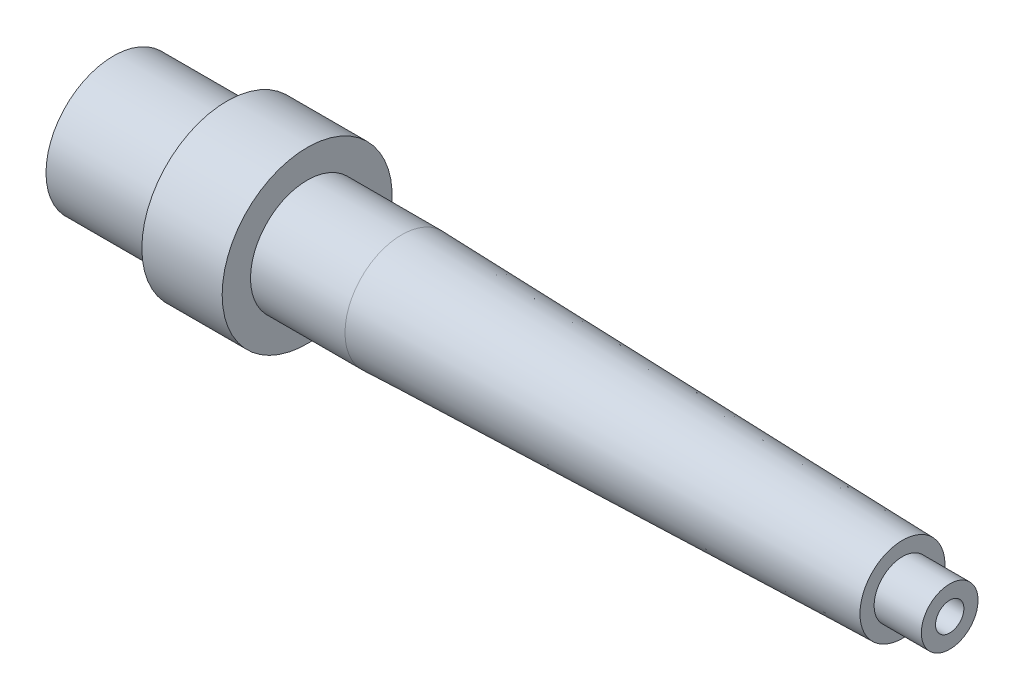
ISO-10303-21;
HEADER;
FILE_DESCRIPTION(('STEP AP214'),'2;1');
FILE_NAME('part.step','',(''),(''),'','','');
FILE_SCHEMA(('AUTOMOTIVE_DESIGN { 1 0 10303 214 1 1 1 1 }'));
ENDSEC;
DATA;
#1=APPLICATION_CONTEXT('core data for automotive mechanical design processes');
#2=APPLICATION_PROTOCOL_DEFINITION('international standard','automotive_design',2000,#1);
#3=PRODUCT_CONTEXT('',#1,'mechanical');
#4=PRODUCT('Part','Part','',(#3));
#5=PRODUCT_RELATED_PRODUCT_CATEGORY('part','',(#4));
#6=PRODUCT_DEFINITION_FORMATION('','',#4);
#7=PRODUCT_DEFINITION_CONTEXT('part definition',#1,'design');
#8=PRODUCT_DEFINITION('design','',#6,#7);
#9=PRODUCT_DEFINITION_SHAPE('','',#8);
#10=(LENGTH_UNIT() NAMED_UNIT(*) SI_UNIT(.MILLI.,.METRE.));
#11=(NAMED_UNIT(*) PLANE_ANGLE_UNIT() SI_UNIT($,.RADIAN.));
#12=(NAMED_UNIT(*) SI_UNIT($,.STERADIAN.) SOLID_ANGLE_UNIT());
#13=UNCERTAINTY_MEASURE_WITH_UNIT(LENGTH_MEASURE(1.E-05),#10,'distance_accuracy_value','');
#14=(GEOMETRIC_REPRESENTATION_CONTEXT(3) GLOBAL_UNCERTAINTY_ASSIGNED_CONTEXT((#13)) GLOBAL_UNIT_ASSIGNED_CONTEXT((#10,
#11,#12)) REPRESENTATION_CONTEXT('',''));
#15=CARTESIAN_POINT('',(0.,0.,0.));
#16=DIRECTION('',(0.,0.,1.));
#17=DIRECTION('',(1.,0.,0.));
#18=AXIS2_PLACEMENT_3D('',#15,#16,#17);
#19=CARTESIAN_POINT('',(-3.60822483003176E-13,7.14375000000422,-1.55431223447522E-12));
#20=DIRECTION('',(1.,0.,0.));
#21=DIRECTION('',(0.,0.,-1.));
#22=AXIS2_PLACEMENT_3D('',#19,#20,#21);
#23=PLANE('',#22);
#24=CARTESIAN_POINT('',(-3.60822483003176E-13,2.77555756156289E-13,-7.7715611723761E-12));
#25=DIRECTION('',(-1.,0.,0.));
#26=DIRECTION('',(0.,0.,1.));
#27=AXIS2_PLACEMENT_3D('',#24,#25,#26);
#28=CIRCLE('',#27,7.14375000000028);
#29=CARTESIAN_POINT('',(-3.63697526956086E-13,2.77555756156289E-13,7.1437499999925));
#30=VERTEX_POINT('',#29);
#31=EDGE_CURVE('E17',#30,#30,#28,.F.);
#32=ORIENTED_EDGE('',*,*,#31,.F.);
#33=EDGE_LOOP('',(#32));
#34=FACE_BOUND('',#33,.T.);
#35=CARTESIAN_POINT('',(0.,2.77555756156289E-13,-7.77156117237619E-12));
#36=DIRECTION('',(-1.,0.,0.));
#37=DIRECTION('',(0.,0.,1.));
#38=AXIS2_PLACEMENT_3D('',#35,#36,#37);
#39=CIRCLE('',#38,3.00000000000108);
#40=CARTESIAN_POINT('',(0.,2.77555756156289E-13,2.99999999999331));
#41=VERTEX_POINT('',#40);
#42=EDGE_CURVE('E48',#41,#41,#39,.F.);
#43=ORIENTED_EDGE('',*,*,#42,.T.);
#44=EDGE_LOOP('',(#43));
#45=FACE_BOUND('',#44,.T.);
#46=ADVANCED_FACE('F14',(#34,#45),#23,.F.);
#47=CARTESIAN_POINT('',(-3.60822483003176E-13,2.77555756156289E-13,-7.7715611723761E-12));
#48=DIRECTION('',(-1.,0.,0.));
#49=DIRECTION('',(0.,0.,1.));
#50=AXIS2_PLACEMENT_3D('',#47,#48,#49);
#51=CYLINDRICAL_SURFACE('',#50,7.14375000000028);
#52=ORIENTED_EDGE('',*,*,#31,.T.);
#53=EDGE_LOOP('',(#52));
#54=FACE_BOUND('',#53,.T.);
#55=CARTESIAN_POINT('',(12.,2.79554157600615E-13,-7.76673170221898E-12));
#56=DIRECTION('',(-1.,0.,0.));
#57=DIRECTION('',(0.,0.,1.));
#58=AXIS2_PLACEMENT_3D('',#55,#56,#57);
#59=CIRCLE('',#58,7.14375000000028);
#60=CARTESIAN_POINT('',(12.,2.79554157600615E-13,7.14374999999251));
#61=VERTEX_POINT('',#60);
#62=EDGE_CURVE('E46',#61,#61,#59,.T.);
#63=ORIENTED_EDGE('',*,*,#62,.T.);
#64=EDGE_LOOP('',(#63));
#65=FACE_BOUND('',#64,.T.);
#66=ADVANCED_FACE('F55',(#54,#65),#51,.T.);
#67=CARTESIAN_POINT('',(2.27374882810771E-10,2.77555756156327E-13,-7.7715611723761E-12));
#68=DIRECTION('',(-1.,0.,0.));
#69=DIRECTION('',(0.,0.,1.));
#70=AXIS2_PLACEMENT_3D('',#67,#68,#69);
#71=CONICAL_SURFACE('',#70,2.99999999999723,0.016947529806404);
#72=CARTESIAN_POINT('',(88.5000000000105,2.922939668086E-13,-7.73594382996721E-12));
#73=DIRECTION('',(-1.,0.,0.));
#74=DIRECTION('',(0.,0.,1.));
#75=AXIS2_PLACEMENT_3D('',#72,#73,#74);
#76=CIRCLE('',#75,1.50000000000099);
#77=CARTESIAN_POINT('',(88.5000000000105,2.922939668086E-13,1.49999999999325));
#78=VERTEX_POINT('',#77);
#79=EDGE_CURVE('E43',#78,#78,#76,.F.);
#80=ORIENTED_EDGE('',*,*,#79,.T.);
#81=EDGE_LOOP('',(#80));
#82=FACE_BOUND('',#81,.T.);
#83=ORIENTED_EDGE('',*,*,#42,.F.);
#84=EDGE_LOOP('',(#83));
#85=FACE_BOUND('',#84,.T.);
#86=ADVANCED_FACE('F63',(#82,#85),#71,.F.);
#87=CARTESIAN_POINT('',(11.9999999999998,8.9999999999989,-7.99360577730113E-12));
#88=DIRECTION('',(1.,0.,0.));
#89=DIRECTION('',(0.,0.,-1.));
#90=AXIS2_PLACEMENT_3D('',#87,#88,#89);
#91=PLANE('',#90);
#92=CARTESIAN_POINT('',(12.,2.79554157600615E-13,-7.76673170221898E-12));
#93=DIRECTION('',(-1.,0.,0.));
#94=DIRECTION('',(0.,0.,1.));
#95=AXIS2_PLACEMENT_3D('',#92,#93,#94);
#96=CIRCLE('',#95,9.00000000000032);
#97=CARTESIAN_POINT('',(12.,2.79554157600615E-13,8.99999999999255));
#98=VERTEX_POINT('',#97);
#99=EDGE_CURVE('E40',#98,#98,#96,.F.);
#100=ORIENTED_EDGE('',*,*,#99,.F.);
#101=EDGE_LOOP('',(#100));
#102=FACE_BOUND('',#101,.T.);
#103=ORIENTED_EDGE('',*,*,#62,.F.);
#104=EDGE_LOOP('',(#103));
#105=FACE_BOUND('',#104,.T.);
#106=ADVANCED_FACE('F95',(#102,#105),#91,.F.);
#107=CARTESIAN_POINT('',(88.5000000000014,1.50000000000033,-2.44249065417534E-12));
#108=DIRECTION('',(-1.,0.,0.));
#109=DIRECTION('',(0.,0.,1.));
#110=AXIS2_PLACEMENT_3D('',#107,#108,#109);
#111=PLANE('',#110);
#112=ORIENTED_EDGE('',*,*,#79,.F.);
#113=EDGE_LOOP('',(#112));
#114=FACE_BOUND('',#113,.T.);
#115=CARTESIAN_POINT('',(88.5000000000003,2.92293966808188E-13,-7.73594382996734E-12));
#116=DIRECTION('',(-1.,0.,0.));
#117=DIRECTION('',(0.,0.,1.));
#118=AXIS2_PLACEMENT_3D('',#115,#116,#117);
#119=CIRCLE('',#118,3.00000000000012);
#120=CARTESIAN_POINT('',(88.5000000000003,2.92293966808188E-13,2.99999999999238));
#121=VERTEX_POINT('',#120);
#122=EDGE_CURVE('E37',#121,#121,#119,.T.);
#123=ORIENTED_EDGE('',*,*,#122,.F.);
#124=EDGE_LOOP('',(#123));
#125=FACE_BOUND('',#124,.T.);
#126=ADVANCED_FACE('F91',(#114,#125),#111,.F.);
#127=CARTESIAN_POINT('',(-3.60822483003176E-13,2.77555756156289E-13,-7.7715611723761E-12));
#128=DIRECTION('',(-1.,0.,0.));
#129=DIRECTION('',(0.,0.,1.));
#130=AXIS2_PLACEMENT_3D('',#127,#128,#129);
#131=CYLINDRICAL_SURFACE('',#130,9.00000000000032);
#132=ORIENTED_EDGE('',*,*,#99,.T.);
#133=EDGE_LOOP('',(#132));
#134=FACE_BOUND('',#133,.T.);
#135=CARTESIAN_POINT('',(20.5,2.80969691957012E-13,-7.76331082752435E-12));
#136=DIRECTION('',(-1.,0.,0.));
#137=DIRECTION('',(0.,0.,1.));
#138=AXIS2_PLACEMENT_3D('',#135,#136,#137);
#139=CIRCLE('',#138,9.00000000000032);
#140=CARTESIAN_POINT('',(20.5,2.80969691957012E-13,8.99999999999256));
#141=VERTEX_POINT('',#140);
#142=EDGE_CURVE('E34',#141,#141,#139,.T.);
#143=ORIENTED_EDGE('',*,*,#142,.T.);
#144=EDGE_LOOP('',(#143));
#145=FACE_BOUND('',#144,.T.);
#146=ADVANCED_FACE('F87',(#134,#145),#131,.T.);
#147=CARTESIAN_POINT('',(-3.60822483003176E-13,2.77555756156289E-13,-7.7715611723761E-12));
#148=DIRECTION('',(-1.,0.,0.));
#149=DIRECTION('',(0.,0.,1.));
#150=AXIS2_PLACEMENT_3D('',#147,#148,#149);
#151=CYLINDRICAL_SURFACE('',#150,3.00000000000012);
#152=CARTESIAN_POINT('',(83.5000000000003,2.91461299539719E-13,-7.73795610919947E-12));
#153=DIRECTION('',(-1.,0.,0.));
#154=DIRECTION('',(0.,0.,1.));
#155=AXIS2_PLACEMENT_3D('',#152,#153,#154);
#156=CIRCLE('',#155,3.00000000000012);
#157=CARTESIAN_POINT('',(83.5000000000003,2.91461299539719E-13,2.99999999999238));
#158=VERTEX_POINT('',#157);
#159=EDGE_CURVE('E31',#158,#158,#156,.F.);
#160=ORIENTED_EDGE('',*,*,#159,.T.);
#161=EDGE_LOOP('',(#160));
#162=FACE_BOUND('',#161,.T.);
#163=ORIENTED_EDGE('',*,*,#122,.T.);
#164=EDGE_LOOP('',(#163));
#165=FACE_BOUND('',#164,.T.);
#166=ADVANCED_FACE('F83',(#162,#165),#151,.T.);
#167=CARTESIAN_POINT('',(20.4999999999999,9.0000000000029,-7.21644966006352E-12));
#168=DIRECTION('',(-1.,0.,0.));
#169=DIRECTION('',(0.,0.,1.));
#170=AXIS2_PLACEMENT_3D('',#167,#168,#169);
#171=PLANE('',#170);
#172=CARTESIAN_POINT('',(20.5,2.80969691957012E-13,-7.76331082752435E-12));
#173=DIRECTION('',(-1.,0.,0.));
#174=DIRECTION('',(0.,0.,1.));
#175=AXIS2_PLACEMENT_3D('',#172,#173,#174);
#176=CIRCLE('',#175,6.0000000000002);
#177=CARTESIAN_POINT('',(20.5,2.80969691957012E-13,5.99999999999244));
#178=VERTEX_POINT('',#177);
#179=EDGE_CURVE('E26',#178,#178,#176,.F.);
#180=ORIENTED_EDGE('',*,*,#179,.F.);
#181=EDGE_LOOP('',(#180));
#182=FACE_BOUND('',#181,.T.);
#183=ORIENTED_EDGE('',*,*,#142,.F.);
#184=EDGE_LOOP('',(#183));
#185=FACE_BOUND('',#184,.T.);
#186=ADVANCED_FACE('F79',(#182,#185),#171,.F.);
#187=CARTESIAN_POINT('',(83.5000000000003,3.00000000000128,-1.77635683940025E-12));
#188=DIRECTION('',(-1.,0.,0.));
#189=DIRECTION('',(0.,0.,1.));
#190=AXIS2_PLACEMENT_3D('',#187,#188,#189);
#191=PLANE('',#190);
#192=ORIENTED_EDGE('',*,*,#159,.F.);
#193=EDGE_LOOP('',(#192));
#194=FACE_BOUND('',#193,.T.);
#195=CARTESIAN_POINT('',(83.500000000015,4.65909718213216E-13,-7.0960309387728E-12));
#196=DIRECTION('',(-1.,0.,0.));
#197=DIRECTION('',(0.,-1.,0.));
#198=AXIS2_PLACEMENT_3D('',#195,#196,#197);
#199=CIRCLE('',#198,4.50000000000194);
#200=CARTESIAN_POINT('',(83.500000000015,-4.50000000000147,-7.0960309387728E-12));
#201=VERTEX_POINT('',#200);
#202=EDGE_CURVE('E21',#201,#201,#199,.T.);
#203=ORIENTED_EDGE('',*,*,#202,.F.);
#204=EDGE_LOOP('',(#203));
#205=FACE_BOUND('',#204,.T.);
#206=ADVANCED_FACE('F72',(#194,#205),#191,.F.);
#207=CARTESIAN_POINT('',(-3.60822483003176E-13,2.77555756156289E-13,-7.7715611723761E-12));
#208=DIRECTION('',(-1.,0.,0.));
#209=DIRECTION('',(0.,0.,1.));
#210=AXIS2_PLACEMENT_3D('',#207,#208,#209);
#211=CYLINDRICAL_SURFACE('',#210,6.0000000000002);
#212=ORIENTED_EDGE('',*,*,#179,.T.);
#213=EDGE_LOOP('',(#212));
#214=FACE_BOUND('',#213,.T.);
#215=CARTESIAN_POINT('',(30.5000000000177,4.35262936804295E-13,-7.12675751746161E-12));
#216=DIRECTION('',(-1.,0.,0.));
#217=DIRECTION('',(0.,0.,1.));
#218=AXIS2_PLACEMENT_3D('',#215,#216,#217);
#219=CIRCLE('',#218,6.00000000000025);
#220=CARTESIAN_POINT('',(30.5000000000177,4.36095604072774E-13,5.99999999999312));
#221=VERTEX_POINT('',#220);
#222=EDGE_CURVE('E10',#221,#221,#219,.F.);
#223=ORIENTED_EDGE('',*,*,#222,.F.);
#224=EDGE_LOOP('',(#223));
#225=FACE_BOUND('',#224,.T.);
#226=ADVANCED_FACE('F66',(#214,#225),#211,.T.);
#227=CARTESIAN_POINT('',(30.5000000000177,4.35262936804295E-13,-7.12667772018172E-12));
#228=DIRECTION('',(-1.,0.,0.));
#229=DIRECTION('',(0.,-1.,0.));
#230=AXIS2_PLACEMENT_3D('',#227,#228,#229);
#231=CONICAL_SURFACE('',#230,6.00000000000025,0.0282943338484733);
#232=ORIENTED_EDGE('',*,*,#222,.T.);
#233=EDGE_LOOP('',(#232));
#234=FACE_BOUND('',#233,.T.);
#235=ORIENTED_EDGE('',*,*,#202,.T.);
#236=EDGE_LOOP('',(#235));
#237=FACE_BOUND('',#236,.T.);
#238=ADVANCED_FACE('F64',(#234,#237),#231,.T.);
#239=CLOSED_SHELL('',(#46,#66,#86,#106,#126,#146,#166,#186,#206,#226,#238));
#240=MANIFOLD_SOLID_BREP('B1',#239);
#241=ADVANCED_BREP_SHAPE_REPRESENTATION('',(#18,#240),#14);
#242=SHAPE_DEFINITION_REPRESENTATION(#9,#241);
ENDSEC;
END-ISO-10303-21;
